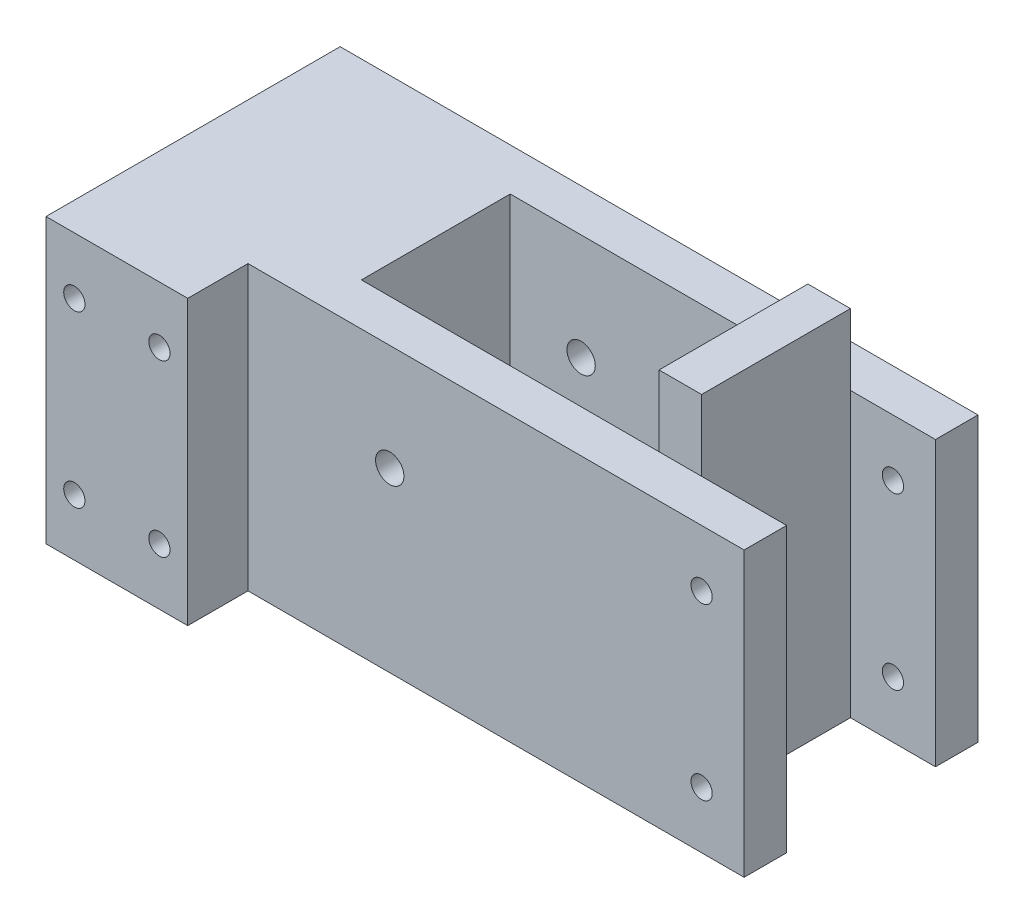
ISO-10303-21;
HEADER;
FILE_DESCRIPTION(('STEP AP214'),'2;1');
FILE_NAME('part.step','',(''),(''),'','','');
FILE_SCHEMA(('AUTOMOTIVE_DESIGN { 1 0 10303 214 1 1 1 1 }'));
ENDSEC;
DATA;
#1=APPLICATION_CONTEXT('core data for automotive mechanical design processes');
#2=APPLICATION_PROTOCOL_DEFINITION('international standard','automotive_design',2000,#1);
#3=PRODUCT_CONTEXT('',#1,'mechanical');
#4=PRODUCT('Part','Part','',(#3));
#5=PRODUCT_RELATED_PRODUCT_CATEGORY('part','',(#4));
#6=PRODUCT_DEFINITION_FORMATION('','',#4);
#7=PRODUCT_DEFINITION_CONTEXT('part definition',#1,'design');
#8=PRODUCT_DEFINITION('design','',#6,#7);
#9=PRODUCT_DEFINITION_SHAPE('','',#8);
#10=(LENGTH_UNIT() NAMED_UNIT(*) SI_UNIT(.MILLI.,.METRE.));
#11=(NAMED_UNIT(*) PLANE_ANGLE_UNIT() SI_UNIT($,.RADIAN.));
#12=(NAMED_UNIT(*) SI_UNIT($,.STERADIAN.) SOLID_ANGLE_UNIT());
#13=UNCERTAINTY_MEASURE_WITH_UNIT(LENGTH_MEASURE(1.E-05),#10,'distance_accuracy_value','');
#14=(GEOMETRIC_REPRESENTATION_CONTEXT(3) GLOBAL_UNCERTAINTY_ASSIGNED_CONTEXT((#13)) GLOBAL_UNIT_ASSIGNED_CONTEXT((#10,
#11,#12)) REPRESENTATION_CONTEXT('',''));
#15=CARTESIAN_POINT('',(0.,0.,0.));
#16=DIRECTION('',(0.,0.,1.));
#17=DIRECTION('',(1.,0.,0.));
#18=AXIS2_PLACEMENT_3D('',#15,#16,#17);
#19=CARTESIAN_POINT('',(30.,40.,-6.));
#20=DIRECTION('',(0.,0.,1.));
#21=DIRECTION('',(1.,0.,0.));
#22=AXIS2_PLACEMENT_3D('',#19,#20,#21);
#23=PLANE('',#22);
#24=CARTESIAN_POINT('',(84.,8.,-6.));
#25=DIRECTION('',(0.,0.,1.));
#26=DIRECTION('',(1.,0.,0.));
#27=AXIS2_PLACEMENT_3D('',#24,#25,#26);
#28=CIRCLE('',#27,1.5);
#29=CARTESIAN_POINT('',(85.5,8.,-6.));
#30=VERTEX_POINT('',#29);
#31=EDGE_CURVE('E242',#30,#30,#28,.T.);
#32=ORIENTED_EDGE('',*,*,#31,.T.);
#33=EDGE_LOOP('',(#32));
#34=FACE_BOUND('',#33,.T.);
#35=CARTESIAN_POINT('',(84.,32.,-6.));
#36=DIRECTION('',(0.,0.,1.));
#37=DIRECTION('',(1.,0.,0.));
#38=AXIS2_PLACEMENT_3D('',#35,#36,#37);
#39=CIRCLE('',#38,1.5);
#40=CARTESIAN_POINT('',(85.5,32.,-6.));
#41=VERTEX_POINT('',#40);
#42=EDGE_CURVE('E254',#41,#41,#39,.T.);
#43=ORIENTED_EDGE('',*,*,#42,.T.);
#44=EDGE_LOOP('',(#43));
#45=FACE_BOUND('',#44,.T.);
#46=DIRECTION('',(0.,-1.,0.));
#47=VECTOR('',#46,1.);
#48=CARTESIAN_POINT('',(78.,50.,-6.));
#49=LINE('',#48,#47);
#50=CARTESIAN_POINT('',(78.,40.,-6.));
#51=VERTEX_POINT('',#50);
#52=CARTESIAN_POINT('',(78.,0.,-6.));
#53=VERTEX_POINT('',#52);
#54=EDGE_CURVE('E199',#51,#53,#49,.T.);
#55=ORIENTED_EDGE('',*,*,#54,.F.);
#56=DIRECTION('',(-1.,0.,0.));
#57=VECTOR('',#56,1.);
#58=CARTESIAN_POINT('',(30.,40.,-6.));
#59=LINE('',#58,#57);
#60=CARTESIAN_POINT('',(90.,40.,-6.));
#61=VERTEX_POINT('',#60);
#62=EDGE_CURVE('E289',#61,#51,#59,.T.);
#63=ORIENTED_EDGE('',*,*,#62,.F.);
#64=DIRECTION('',(0.,-1.,0.));
#65=VECTOR('',#64,1.);
#66=CARTESIAN_POINT('',(90.,40.,-6.));
#67=LINE('',#66,#65);
#68=CARTESIAN_POINT('',(90.,0.,-6.));
#69=VERTEX_POINT('',#68);
#70=EDGE_CURVE('E51',#61,#69,#67,.T.);
#71=ORIENTED_EDGE('',*,*,#70,.T.);
#72=DIRECTION('',(-1.,0.,0.));
#73=VECTOR('',#72,1.);
#74=CARTESIAN_POINT('',(30.,0.,-6.));
#75=LINE('',#74,#73);
#76=EDGE_CURVE('E306',#69,#53,#75,.T.);
#77=ORIENTED_EDGE('',*,*,#76,.T.);
#78=EDGE_LOOP('',(#55,#63,#71,#77));
#79=FACE_BOUND('',#78,.T.);
#80=ADVANCED_FACE('F43',(#34,#45,#79),#23,.F.);
#81=CARTESIAN_POINT('',(90.,40.,-27.0000000000001));
#82=DIRECTION('',(0.,0.,-1.));
#83=DIRECTION('',(-1.,0.,0.));
#84=AXIS2_PLACEMENT_3D('',#81,#82,#83);
#85=PLANE('',#84);
#86=CARTESIAN_POINT('',(40.,25.,-27.0000000000001));
#87=DIRECTION('',(0.,0.,-1.));
#88=DIRECTION('',(-1.,0.,0.));
#89=AXIS2_PLACEMENT_3D('',#86,#87,#88);
#90=CIRCLE('',#89,2.);
#91=CARTESIAN_POINT('',(38.,25.,-27.0000000000001));
#92=VERTEX_POINT('',#91);
#93=EDGE_CURVE('E185',#92,#92,#90,.T.);
#94=ORIENTED_EDGE('',*,*,#93,.T.);
#95=EDGE_LOOP('',(#94));
#96=FACE_BOUND('',#95,.T.);
#97=DIRECTION('',(0.,-1.,0.));
#98=VECTOR('',#97,1.);
#99=CARTESIAN_POINT('',(72.,50.,-27.0000000000001));
#100=LINE('',#99,#98);
#101=CARTESIAN_POINT('',(72.,40.,-27.0000000000001));
#102=VERTEX_POINT('',#101);
#103=CARTESIAN_POINT('',(72.,0.,-27.0000000000001));
#104=VERTEX_POINT('',#103);
#105=EDGE_CURVE('E66',#102,#104,#100,.T.);
#106=ORIENTED_EDGE('',*,*,#105,.F.);
#107=DIRECTION('',(1.,0.,0.));
#108=VECTOR('',#107,1.);
#109=CARTESIAN_POINT('',(90.,40.,-27.0000000000001));
#110=LINE('',#109,#108);
#111=CARTESIAN_POINT('',(30.,40.,-27.0000000000001));
#112=VERTEX_POINT('',#111);
#113=EDGE_CURVE('E291',#112,#102,#110,.T.);
#114=ORIENTED_EDGE('',*,*,#113,.F.);
#115=DIRECTION('',(0.,-1.,0.));
#116=VECTOR('',#115,1.);
#117=CARTESIAN_POINT('',(30.,40.,-27.0000000000001));
#118=LINE('',#117,#116);
#119=CARTESIAN_POINT('',(30.,0.,-27.0000000000001));
#120=VERTEX_POINT('',#119);
#121=EDGE_CURVE('E160',#112,#120,#118,.T.);
#122=ORIENTED_EDGE('',*,*,#121,.T.);
#123=DIRECTION('',(1.,0.,0.));
#124=VECTOR('',#123,1.);
#125=CARTESIAN_POINT('',(90.,0.,-27.0000000000001));
#126=LINE('',#125,#124);
#127=EDGE_CURVE('E158',#120,#104,#126,.T.);
#128=ORIENTED_EDGE('',*,*,#127,.T.);
#129=EDGE_LOOP('',(#106,#114,#122,#128));
#130=FACE_BOUND('',#129,.T.);
#131=ADVANCED_FACE('F159',(#96,#130),#85,.F.);
#132=CARTESIAN_POINT('',(0.,40.,0.));
#133=DIRECTION('',(0.,0.,-1.));
#134=DIRECTION('',(-1.,0.,0.));
#135=AXIS2_PLACEMENT_3D('',#132,#133,#134);
#136=PLANE('',#135);
#137=CARTESIAN_POINT('',(40.,25.,0.));
#138=DIRECTION('',(0.,0.,1.));
#139=DIRECTION('',(1.,0.,0.));
#140=AXIS2_PLACEMENT_3D('',#137,#138,#139);
#141=CIRCLE('',#140,2.);
#142=CARTESIAN_POINT('',(42.,25.,0.));
#143=VERTEX_POINT('',#142);
#144=EDGE_CURVE('E471',#143,#143,#141,.T.);
#145=ORIENTED_EDGE('',*,*,#144,.F.);
#146=EDGE_LOOP('',(#145));
#147=FACE_BOUND('',#146,.T.);
#148=CARTESIAN_POINT('',(84.,32.,0.));
#149=DIRECTION('',(0.,0.,-1.));
#150=DIRECTION('',(-1.,0.,0.));
#151=AXIS2_PLACEMENT_3D('',#148,#149,#150);
#152=CIRCLE('',#151,1.5);
#153=CARTESIAN_POINT('',(82.5,32.,0.));
#154=VERTEX_POINT('',#153);
#155=EDGE_CURVE('E259',#154,#154,#152,.T.);
#156=ORIENTED_EDGE('',*,*,#155,.T.);
#157=EDGE_LOOP('',(#156));
#158=FACE_BOUND('',#157,.T.);
#159=CARTESIAN_POINT('',(84.,8.,0.));
#160=DIRECTION('',(0.,0.,-1.));
#161=DIRECTION('',(-1.,0.,0.));
#162=AXIS2_PLACEMENT_3D('',#159,#160,#161);
#163=CIRCLE('',#162,1.5);
#164=CARTESIAN_POINT('',(82.5,8.,0.));
#165=VERTEX_POINT('',#164);
#166=EDGE_CURVE('E250',#165,#165,#163,.T.);
#167=ORIENTED_EDGE('',*,*,#166,.T.);
#168=EDGE_LOOP('',(#167));
#169=FACE_BOUND('',#168,.T.);
#170=DIRECTION('',(0.,1.,0.));
#171=VECTOR('',#170,1.);
#172=CARTESIAN_POINT('',(20.,-21.7313138121007,0.));
#173=LINE('',#172,#171);
#174=CARTESIAN_POINT('',(20.,0.,0.));
#175=VERTEX_POINT('',#174);
#176=CARTESIAN_POINT('',(20.,40.,0.));
#177=VERTEX_POINT('',#176);
#178=EDGE_CURVE('E275',#175,#177,#173,.T.);
#179=ORIENTED_EDGE('',*,*,#178,.F.);
#180=DIRECTION('',(1.,0.,0.));
#181=VECTOR('',#180,1.);
#182=CARTESIAN_POINT('',(0.,0.,0.));
#183=LINE('',#182,#181);
#184=CARTESIAN_POINT('',(90.,0.,0.));
#185=VERTEX_POINT('',#184);
#186=EDGE_CURVE('E305',#175,#185,#183,.T.);
#187=ORIENTED_EDGE('',*,*,#186,.T.);
#188=DIRECTION('',(0.,-1.,0.));
#189=VECTOR('',#188,1.);
#190=CARTESIAN_POINT('',(90.,40.,0.));
#191=LINE('',#190,#189);
#192=CARTESIAN_POINT('',(90.,40.,0.));
#193=VERTEX_POINT('',#192);
#194=EDGE_CURVE('E11',#193,#185,#191,.T.);
#195=ORIENTED_EDGE('',*,*,#194,.F.);
#196=DIRECTION('',(1.,0.,0.));
#197=VECTOR('',#196,1.);
#198=CARTESIAN_POINT('',(0.,40.,0.));
#199=LINE('',#198,#197);
#200=EDGE_CURVE('E281',#177,#193,#199,.T.);
#201=ORIENTED_EDGE('',*,*,#200,.F.);
#202=EDGE_LOOP('',(#179,#187,#195,#201));
#203=FACE_BOUND('',#202,.T.);
#204=ADVANCED_FACE('F381',(#147,#158,#169,#203),#136,.F.);
#205=CARTESIAN_POINT('',(0.,40.,-33.0000000000001));
#206=DIRECTION('',(1.,0.,0.));
#207=DIRECTION('',(0.,0.,-1.));
#208=AXIS2_PLACEMENT_3D('',#205,#206,#207);
#209=PLANE('',#208);
#210=DIRECTION('',(0.,0.,1.));
#211=VECTOR('',#210,1.);
#212=CARTESIAN_POINT('',(0.,0.,-33.0000000000001));
#213=LINE('',#212,#211);
#214=CARTESIAN_POINT('',(0.,0.,-33.0000000000001));
#215=VERTEX_POINT('',#214);
#216=CARTESIAN_POINT('',(0.,0.,8.5));
#217=VERTEX_POINT('',#216);
#218=EDGE_CURVE('E268',#215,#217,#213,.T.);
#219=ORIENTED_EDGE('',*,*,#218,.T.);
#220=DIRECTION('',(0.,1.,0.));
#221=VECTOR('',#220,1.);
#222=CARTESIAN_POINT('',(0.,-21.7313138121007,8.5));
#223=LINE('',#222,#221);
#224=CARTESIAN_POINT('',(0.,40.,8.5));
#225=VERTEX_POINT('',#224);
#226=EDGE_CURVE('E274',#217,#225,#223,.T.);
#227=ORIENTED_EDGE('',*,*,#226,.T.);
#228=DIRECTION('',(0.,0.,1.));
#229=VECTOR('',#228,1.);
#230=CARTESIAN_POINT('',(0.,40.,-33.0000000000001));
#231=LINE('',#230,#229);
#232=CARTESIAN_POINT('',(0.,40.,-33.0000000000001));
#233=VERTEX_POINT('',#232);
#234=EDGE_CURVE('E278',#233,#225,#231,.T.);
#235=ORIENTED_EDGE('',*,*,#234,.F.);
#236=DIRECTION('',(0.,-1.,0.));
#237=VECTOR('',#236,1.);
#238=CARTESIAN_POINT('',(0.,40.,-33.0000000000001));
#239=LINE('',#238,#237);
#240=EDGE_CURVE('E297',#233,#215,#239,.T.);
#241=ORIENTED_EDGE('',*,*,#240,.T.);
#242=EDGE_LOOP('',(#219,#227,#235,#241));
#243=FACE_BOUND('',#242,.T.);
#244=ADVANCED_FACE('F44',(#243),#209,.F.);
#245=CARTESIAN_POINT('',(90.,40.,-6.));
#246=DIRECTION('',(-1.,0.,0.));
#247=DIRECTION('',(0.,0.,1.));
#248=AXIS2_PLACEMENT_3D('',#245,#246,#247);
#249=PLANE('',#248);
#250=DIRECTION('',(0.,0.,-1.));
#251=VECTOR('',#250,1.);
#252=CARTESIAN_POINT('',(90.,0.,-6.));
#253=LINE('',#252,#251);
#254=EDGE_CURVE('E302',#185,#69,#253,.T.);
#255=ORIENTED_EDGE('',*,*,#254,.T.);
#256=ORIENTED_EDGE('',*,*,#70,.F.);
#257=DIRECTION('',(0.,0.,-1.));
#258=VECTOR('',#257,1.);
#259=CARTESIAN_POINT('',(90.,40.,-6.));
#260=LINE('',#259,#258);
#261=EDGE_CURVE('E283',#193,#61,#260,.T.);
#262=ORIENTED_EDGE('',*,*,#261,.F.);
#263=ORIENTED_EDGE('',*,*,#194,.T.);
#264=EDGE_LOOP('',(#255,#256,#262,#263));
#265=FACE_BOUND('',#264,.T.);
#266=ADVANCED_FACE('F383',(#265),#249,.F.);
#267=CARTESIAN_POINT('',(40.,25.,-6.));
#268=DIRECTION('',(0.,0.,1.));
#269=DIRECTION('',(1.,0.,0.));
#270=AXIS2_PLACEMENT_3D('',#267,#268,#269);
#271=CIRCLE('',#270,2.);
#272=CARTESIAN_POINT('',(42.,25.,-6.));
#273=VERTEX_POINT('',#272);
#274=EDGE_CURVE('E189',#273,#273,#271,.T.);
#275=ORIENTED_EDGE('',*,*,#274,.T.);
#276=EDGE_LOOP('',(#275));
#277=FACE_BOUND('',#276,.T.);
#278=CARTESIAN_POINT('',(72.,40.,-6.));
#279=VERTEX_POINT('',#278);
#280=CARTESIAN_POINT('',(30.,40.,-6.));
#281=VERTEX_POINT('',#280);
#282=EDGE_CURVE('E288',#279,#281,#59,.T.);
#283=ORIENTED_EDGE('',*,*,#282,.F.);
#284=DIRECTION('',(0.,-1.,0.));
#285=VECTOR('',#284,1.);
#286=CARTESIAN_POINT('',(72.,50.,-6.));
#287=LINE('',#286,#285);
#288=CARTESIAN_POINT('',(72.,0.,-6.));
#289=VERTEX_POINT('',#288);
#290=EDGE_CURVE('E205',#279,#289,#287,.T.);
#291=ORIENTED_EDGE('',*,*,#290,.T.);
#292=CARTESIAN_POINT('',(30.,0.,-6.));
#293=VERTEX_POINT('',#292);
#294=EDGE_CURVE('E179',#289,#293,#75,.T.);
#295=ORIENTED_EDGE('',*,*,#294,.T.);
#296=DIRECTION('',(0.,-1.,0.));
#297=VECTOR('',#296,1.);
#298=CARTESIAN_POINT('',(30.,40.,-6.));
#299=LINE('',#298,#297);
#300=EDGE_CURVE('E324',#281,#293,#299,.T.);
#301=ORIENTED_EDGE('',*,*,#300,.F.);
#302=EDGE_LOOP('',(#283,#291,#295,#301));
#303=FACE_BOUND('',#302,.T.);
#304=ADVANCED_FACE('F355',(#277,#303),#23,.F.);
#305=CARTESIAN_POINT('',(30.,40.,-27.0000000000001));
#306=DIRECTION('',(-1.,0.,0.));
#307=DIRECTION('',(0.,0.,1.));
#308=AXIS2_PLACEMENT_3D('',#305,#306,#307);
#309=PLANE('',#308);
#310=DIRECTION('',(0.,0.,-1.));
#311=VECTOR('',#310,1.);
#312=CARTESIAN_POINT('',(30.,0.,-27.0000000000001));
#313=LINE('',#312,#311);
#314=EDGE_CURVE('E308',#293,#120,#313,.T.);
#315=ORIENTED_EDGE('',*,*,#314,.T.);
#316=ORIENTED_EDGE('',*,*,#121,.F.);
#317=DIRECTION('',(0.,0.,-1.));
#318=VECTOR('',#317,1.);
#319=CARTESIAN_POINT('',(30.,40.,-27.0000000000001));
#320=LINE('',#319,#318);
#321=EDGE_CURVE('E286',#281,#112,#320,.T.);
#322=ORIENTED_EDGE('',*,*,#321,.F.);
#323=ORIENTED_EDGE('',*,*,#300,.T.);
#324=EDGE_LOOP('',(#315,#316,#322,#323));
#325=FACE_BOUND('',#324,.T.);
#326=ADVANCED_FACE('F358',(#325),#309,.F.);
#327=CARTESIAN_POINT('',(84.,32.,-27.0000000000001));
#328=DIRECTION('',(0.,0.,-1.));
#329=DIRECTION('',(-1.,0.,0.));
#330=AXIS2_PLACEMENT_3D('',#327,#328,#329);
#331=CIRCLE('',#330,1.5);
#332=CARTESIAN_POINT('',(82.5,32.,-27.0000000000001));
#333=VERTEX_POINT('',#332);
#334=EDGE_CURVE('E249',#333,#333,#331,.T.);
#335=ORIENTED_EDGE('',*,*,#334,.T.);
#336=EDGE_LOOP('',(#335));
#337=FACE_BOUND('',#336,.T.);
#338=CARTESIAN_POINT('',(84.,8.,-27.0000000000001));
#339=DIRECTION('',(0.,0.,-1.));
#340=DIRECTION('',(-1.,0.,0.));
#341=AXIS2_PLACEMENT_3D('',#338,#339,#340);
#342=CIRCLE('',#341,1.5);
#343=CARTESIAN_POINT('',(82.5,8.,-27.0000000000001));
#344=VERTEX_POINT('',#343);
#345=EDGE_CURVE('E241',#344,#344,#342,.T.);
#346=ORIENTED_EDGE('',*,*,#345,.T.);
#347=EDGE_LOOP('',(#346));
#348=FACE_BOUND('',#347,.T.);
#349=CARTESIAN_POINT('',(78.,40.,-27.0000000000001));
#350=VERTEX_POINT('',#349);
#351=CARTESIAN_POINT('',(90.,40.,-27.0000000000001));
#352=VERTEX_POINT('',#351);
#353=EDGE_CURVE('E59',#350,#352,#110,.T.);
#354=ORIENTED_EDGE('',*,*,#353,.F.);
#355=DIRECTION('',(0.,-1.,0.));
#356=VECTOR('',#355,1.);
#357=CARTESIAN_POINT('',(78.,50.,-27.0000000000001));
#358=LINE('',#357,#356);
#359=CARTESIAN_POINT('',(78.,0.,-27.0000000000001));
#360=VERTEX_POINT('',#359);
#361=EDGE_CURVE('E210',#350,#360,#358,.T.);
#362=ORIENTED_EDGE('',*,*,#361,.T.);
#363=CARTESIAN_POINT('',(90.,0.,-27.0000000000001));
#364=VERTEX_POINT('',#363);
#365=EDGE_CURVE('E165',#360,#364,#126,.T.);
#366=ORIENTED_EDGE('',*,*,#365,.T.);
#367=DIRECTION('',(0.,-1.,0.));
#368=VECTOR('',#367,1.);
#369=CARTESIAN_POINT('',(90.,40.,-27.0000000000001));
#370=LINE('',#369,#368);
#371=EDGE_CURVE('E320',#352,#364,#370,.T.);
#372=ORIENTED_EDGE('',*,*,#371,.F.);
#373=EDGE_LOOP('',(#354,#362,#366,#372));
#374=FACE_BOUND('',#373,.T.);
#375=ADVANCED_FACE('F365',(#337,#348,#374),#85,.F.);
#376=CARTESIAN_POINT('',(90.,40.,-33.0000000000001));
#377=DIRECTION('',(-1.,0.,0.));
#378=DIRECTION('',(0.,0.,1.));
#379=AXIS2_PLACEMENT_3D('',#376,#377,#378);
#380=PLANE('',#379);
#381=DIRECTION('',(0.,0.,-1.));
#382=VECTOR('',#381,1.);
#383=CARTESIAN_POINT('',(90.,0.,-33.0000000000001));
#384=LINE('',#383,#382);
#385=CARTESIAN_POINT('',(90.,0.,-33.0000000000001));
#386=VERTEX_POINT('',#385);
#387=EDGE_CURVE('E161',#364,#386,#384,.T.);
#388=ORIENTED_EDGE('',*,*,#387,.T.);
#389=DIRECTION('',(0.,-1.,0.));
#390=VECTOR('',#389,1.);
#391=CARTESIAN_POINT('',(90.,40.,-33.0000000000001));
#392=LINE('',#391,#390);
#393=CARTESIAN_POINT('',(90.,40.,-33.0000000000001));
#394=VERTEX_POINT('',#393);
#395=EDGE_CURVE('E313',#394,#386,#392,.T.);
#396=ORIENTED_EDGE('',*,*,#395,.F.);
#397=DIRECTION('',(0.,0.,-1.));
#398=VECTOR('',#397,1.);
#399=CARTESIAN_POINT('',(90.,40.,-33.0000000000001));
#400=LINE('',#399,#398);
#401=EDGE_CURVE('E294',#352,#394,#400,.T.);
#402=ORIENTED_EDGE('',*,*,#401,.F.);
#403=ORIENTED_EDGE('',*,*,#371,.T.);
#404=EDGE_LOOP('',(#388,#396,#402,#403));
#405=FACE_BOUND('',#404,.T.);
#406=ADVANCED_FACE('F364',(#405),#380,.F.);
#407=CARTESIAN_POINT('',(0.,40.,-33.0000000000001));
#408=DIRECTION('',(0.,0.,1.));
#409=DIRECTION('',(1.,0.,0.));
#410=AXIS2_PLACEMENT_3D('',#407,#408,#409);
#411=PLANE('',#410);
#412=CARTESIAN_POINT('',(40.,25.,-33.0000000000001));
#413=DIRECTION('',(0.,0.,1.));
#414=DIRECTION('',(1.,0.,0.));
#415=AXIS2_PLACEMENT_3D('',#412,#413,#414);
#416=CIRCLE('',#415,2.);
#417=CARTESIAN_POINT('',(42.,25.,-33.0000000000001));
#418=VERTEX_POINT('',#417);
#419=EDGE_CURVE('E468',#418,#418,#416,.T.);
#420=ORIENTED_EDGE('',*,*,#419,.T.);
#421=EDGE_LOOP('',(#420));
#422=FACE_BOUND('',#421,.T.);
#423=CARTESIAN_POINT('',(3.99999999999996,32.,-33.0000000000001));
#424=DIRECTION('',(0.,0.,1.));
#425=DIRECTION('',(1.,0.,0.));
#426=AXIS2_PLACEMENT_3D('',#423,#424,#425);
#427=CIRCLE('',#426,1.5);
#428=CARTESIAN_POINT('',(5.49999999999996,32.,-33.0000000000001));
#429=VERTEX_POINT('',#428);
#430=EDGE_CURVE('E211',#429,#429,#427,.T.);
#431=ORIENTED_EDGE('',*,*,#430,.T.);
#432=EDGE_LOOP('',(#431));
#433=FACE_BOUND('',#432,.T.);
#434=CARTESIAN_POINT('',(3.99999999999996,8.,-33.0000000000001));
#435=DIRECTION('',(0.,0.,1.));
#436=DIRECTION('',(1.,0.,0.));
#437=AXIS2_PLACEMENT_3D('',#434,#435,#436);
#438=CIRCLE('',#437,1.5);
#439=CARTESIAN_POINT('',(5.49999999999996,8.,-33.0000000000001));
#440=VERTEX_POINT('',#439);
#441=EDGE_CURVE('E214',#440,#440,#438,.T.);
#442=ORIENTED_EDGE('',*,*,#441,.T.);
#443=EDGE_LOOP('',(#442));
#444=FACE_BOUND('',#443,.T.);
#445=CARTESIAN_POINT('',(16.,8.,-33.0000000000001));
#446=DIRECTION('',(0.,0.,-1.));
#447=DIRECTION('',(-1.,0.,0.));
#448=AXIS2_PLACEMENT_3D('',#445,#446,#447);
#449=CIRCLE('',#448,1.5);
#450=CARTESIAN_POINT('',(14.5,8.,-33.0000000000001));
#451=VERTEX_POINT('',#450);
#452=EDGE_CURVE('E234',#451,#451,#449,.T.);
#453=ORIENTED_EDGE('',*,*,#452,.F.);
#454=EDGE_LOOP('',(#453));
#455=FACE_BOUND('',#454,.T.);
#456=CARTESIAN_POINT('',(16.,32.,-33.0000000000001));
#457=DIRECTION('',(0.,0.,-1.));
#458=DIRECTION('',(-1.,0.,0.));
#459=AXIS2_PLACEMENT_3D('',#456,#457,#458);
#460=CIRCLE('',#459,1.5);
#461=CARTESIAN_POINT('',(14.5,32.,-33.0000000000001));
#462=VERTEX_POINT('',#461);
#463=EDGE_CURVE('E226',#462,#462,#460,.T.);
#464=ORIENTED_EDGE('',*,*,#463,.F.);
#465=EDGE_LOOP('',(#464));
#466=FACE_BOUND('',#465,.T.);
#467=CARTESIAN_POINT('',(84.,32.,-33.0000000000001));
#468=DIRECTION('',(0.,0.,-1.));
#469=DIRECTION('',(-1.,0.,0.));
#470=AXIS2_PLACEMENT_3D('',#467,#468,#469);
#471=CIRCLE('',#470,1.5);
#472=CARTESIAN_POINT('',(82.5,32.,-33.0000000000001));
#473=VERTEX_POINT('',#472);
#474=EDGE_CURVE('E225',#473,#473,#471,.T.);
#475=ORIENTED_EDGE('',*,*,#474,.F.);
#476=EDGE_LOOP('',(#475));
#477=FACE_BOUND('',#476,.T.);
#478=CARTESIAN_POINT('',(84.,8.,-33.0000000000001));
#479=DIRECTION('',(0.,0.,-1.));
#480=DIRECTION('',(-1.,0.,0.));
#481=AXIS2_PLACEMENT_3D('',#478,#479,#480);
#482=CIRCLE('',#481,1.5);
#483=CARTESIAN_POINT('',(82.5,8.,-33.0000000000001));
#484=VERTEX_POINT('',#483);
#485=EDGE_CURVE('E227',#484,#484,#482,.T.);
#486=ORIENTED_EDGE('',*,*,#485,.F.);
#487=EDGE_LOOP('',(#486));
#488=FACE_BOUND('',#487,.T.);
#489=DIRECTION('',(-1.,0.,0.));
#490=VECTOR('',#489,1.);
#491=CARTESIAN_POINT('',(0.,0.,-33.0000000000001));
#492=LINE('',#491,#490);
#493=EDGE_CURVE('E285',#386,#215,#492,.T.);
#494=ORIENTED_EDGE('',*,*,#493,.T.);
#495=ORIENTED_EDGE('',*,*,#240,.F.);
#496=DIRECTION('',(-1.,0.,0.));
#497=VECTOR('',#496,1.);
#498=CARTESIAN_POINT('',(0.,40.,-33.0000000000001));
#499=LINE('',#498,#497);
#500=EDGE_CURVE('E296',#394,#233,#499,.T.);
#501=ORIENTED_EDGE('',*,*,#500,.F.);
#502=ORIENTED_EDGE('',*,*,#395,.T.);
#503=EDGE_LOOP('',(#494,#495,#501,#502));
#504=FACE_BOUND('',#503,.T.);
#505=ADVANCED_FACE('F367',(#422,#433,#444,#455,#466,#477,#488,#504),#411,.F.);
#506=CARTESIAN_POINT('',(0.,40.,0.));
#507=DIRECTION('',(0.,1.,0.));
#508=DIRECTION('',(0.,0.,1.));
#509=AXIS2_PLACEMENT_3D('',#506,#507,#508);
#510=PLANE('',#509);
#511=ORIENTED_EDGE('',*,*,#234,.T.);
#512=DIRECTION('',(1.,0.,0.));
#513=VECTOR('',#512,1.);
#514=CARTESIAN_POINT('',(20.,40.,8.5));
#515=LINE('',#514,#513);
#516=CARTESIAN_POINT('',(20.,40.,8.5));
#517=VERTEX_POINT('',#516);
#518=EDGE_CURVE('E270',#225,#517,#515,.T.);
#519=ORIENTED_EDGE('',*,*,#518,.T.);
#520=DIRECTION('',(0.,0.,-1.));
#521=VECTOR('',#520,1.);
#522=CARTESIAN_POINT('',(20.,40.,8.5));
#523=LINE('',#522,#521);
#524=EDGE_CURVE('E258',#517,#177,#523,.T.);
#525=ORIENTED_EDGE('',*,*,#524,.T.);
#526=ORIENTED_EDGE('',*,*,#200,.T.);
#527=ORIENTED_EDGE('',*,*,#261,.T.);
#528=ORIENTED_EDGE('',*,*,#62,.T.);
#529=EDGE_CURVE('E293',#51,#279,#59,.T.);
#530=ORIENTED_EDGE('',*,*,#529,.T.);
#531=ORIENTED_EDGE('',*,*,#282,.T.);
#532=ORIENTED_EDGE('',*,*,#321,.T.);
#533=ORIENTED_EDGE('',*,*,#113,.T.);
#534=EDGE_CURVE('E298',#102,#350,#110,.T.);
#535=ORIENTED_EDGE('',*,*,#534,.T.);
#536=ORIENTED_EDGE('',*,*,#353,.T.);
#537=ORIENTED_EDGE('',*,*,#401,.T.);
#538=ORIENTED_EDGE('',*,*,#500,.T.);
#539=EDGE_LOOP('',(#511,#519,#525,#526,#527,#528,#530,#531,#532,#533,#535,#536,#537,#538));
#540=FACE_BOUND('',#539,.T.);
#541=ADVANCED_FACE('F346',(#540),#510,.T.);
#542=CARTESIAN_POINT('',(0.,0.,0.));
#543=DIRECTION('',(0.,1.,0.));
#544=DIRECTION('',(0.,0.,1.));
#545=AXIS2_PLACEMENT_3D('',#542,#543,#544);
#546=PLANE('',#545);
#547=ORIENTED_EDGE('',*,*,#294,.F.);
#548=DIRECTION('',(0.,0.,-1.));
#549=VECTOR('',#548,1.);
#550=CARTESIAN_POINT('',(72.,0.,-27.0000000000001));
#551=LINE('',#550,#549);
#552=EDGE_CURVE('E171',#289,#104,#551,.T.);
#553=ORIENTED_EDGE('',*,*,#552,.T.);
#554=ORIENTED_EDGE('',*,*,#127,.F.);
#555=ORIENTED_EDGE('',*,*,#314,.F.);
#556=EDGE_LOOP('',(#547,#553,#554,#555));
#557=FACE_BOUND('',#556,.T.);
#558=ORIENTED_EDGE('',*,*,#218,.F.);
#559=ORIENTED_EDGE('',*,*,#493,.F.);
#560=ORIENTED_EDGE('',*,*,#387,.F.);
#561=ORIENTED_EDGE('',*,*,#365,.F.);
#562=DIRECTION('',(0.,0.,1.));
#563=VECTOR('',#562,1.);
#564=CARTESIAN_POINT('',(78.,0.,-27.0000000000001));
#565=LINE('',#564,#563);
#566=EDGE_CURVE('E181',#360,#53,#565,.T.);
#567=ORIENTED_EDGE('',*,*,#566,.T.);
#568=ORIENTED_EDGE('',*,*,#76,.F.);
#569=ORIENTED_EDGE('',*,*,#254,.F.);
#570=ORIENTED_EDGE('',*,*,#186,.F.);
#571=DIRECTION('',(0.,0.,1.));
#572=VECTOR('',#571,1.);
#573=CARTESIAN_POINT('',(20.,0.,8.5));
#574=LINE('',#573,#572);
#575=CARTESIAN_POINT('',(20.,0.,8.5));
#576=VERTEX_POINT('',#575);
#577=EDGE_CURVE('E262',#175,#576,#574,.T.);
#578=ORIENTED_EDGE('',*,*,#577,.T.);
#579=DIRECTION('',(-1.,0.,0.));
#580=VECTOR('',#579,1.);
#581=CARTESIAN_POINT('',(20.,0.,8.5));
#582=LINE('',#581,#580);
#583=EDGE_CURVE('E257',#576,#217,#582,.T.);
#584=ORIENTED_EDGE('',*,*,#583,.T.);
#585=EDGE_LOOP('',(#558,#559,#560,#561,#567,#568,#569,#570,#578,#584));
#586=FACE_BOUND('',#585,.T.);
#587=ADVANCED_FACE('F178',(#557,#586),#546,.F.);
#588=CARTESIAN_POINT('',(20.,-21.7313138121007,8.5));
#589=DIRECTION('',(1.,0.,0.));
#590=DIRECTION('',(0.,0.,-1.));
#591=AXIS2_PLACEMENT_3D('',#588,#589,#590);
#592=PLANE('',#591);
#593=ORIENTED_EDGE('',*,*,#577,.F.);
#594=ORIENTED_EDGE('',*,*,#178,.T.);
#595=ORIENTED_EDGE('',*,*,#524,.F.);
#596=DIRECTION('',(0.,1.,0.));
#597=VECTOR('',#596,1.);
#598=CARTESIAN_POINT('',(20.,-21.7313138121007,8.5));
#599=LINE('',#598,#597);
#600=EDGE_CURVE('E263',#576,#517,#599,.T.);
#601=ORIENTED_EDGE('',*,*,#600,.F.);
#602=EDGE_LOOP('',(#593,#594,#595,#601));
#603=FACE_BOUND('',#602,.T.);
#604=ADVANCED_FACE('F382',(#603),#592,.T.);
#605=CARTESIAN_POINT('',(20.,-21.7313138121007,8.5));
#606=DIRECTION('',(0.,0.,1.));
#607=DIRECTION('',(1.,0.,0.));
#608=AXIS2_PLACEMENT_3D('',#605,#606,#607);
#609=PLANE('',#608);
#610=CARTESIAN_POINT('',(3.99999999999996,32.,8.5));
#611=DIRECTION('',(0.,0.,1.));
#612=DIRECTION('',(1.,0.,0.));
#613=AXIS2_PLACEMENT_3D('',#610,#611,#612);
#614=CIRCLE('',#613,1.5);
#615=CARTESIAN_POINT('',(5.49999999999996,32.,8.5));
#616=VERTEX_POINT('',#615);
#617=EDGE_CURVE('E216',#616,#616,#614,.T.);
#618=ORIENTED_EDGE('',*,*,#617,.F.);
#619=EDGE_LOOP('',(#618));
#620=FACE_BOUND('',#619,.T.);
#621=CARTESIAN_POINT('',(3.99999999999996,8.,8.5));
#622=DIRECTION('',(0.,0.,1.));
#623=DIRECTION('',(1.,0.,0.));
#624=AXIS2_PLACEMENT_3D('',#621,#622,#623);
#625=CIRCLE('',#624,1.5);
#626=CARTESIAN_POINT('',(5.49999999999996,8.,8.5));
#627=VERTEX_POINT('',#626);
#628=EDGE_CURVE('E218',#627,#627,#625,.T.);
#629=ORIENTED_EDGE('',*,*,#628,.F.);
#630=EDGE_LOOP('',(#629));
#631=FACE_BOUND('',#630,.T.);
#632=CARTESIAN_POINT('',(16.,8.,8.5));
#633=DIRECTION('',(0.,0.,-1.));
#634=DIRECTION('',(-1.,0.,0.));
#635=AXIS2_PLACEMENT_3D('',#632,#633,#634);
#636=CIRCLE('',#635,1.5);
#637=CARTESIAN_POINT('',(14.5,8.,8.5));
#638=VERTEX_POINT('',#637);
#639=EDGE_CURVE('E212',#638,#638,#636,.T.);
#640=ORIENTED_EDGE('',*,*,#639,.T.);
#641=EDGE_LOOP('',(#640));
#642=FACE_BOUND('',#641,.T.);
#643=CARTESIAN_POINT('',(16.,32.,8.5));
#644=DIRECTION('',(0.,0.,-1.));
#645=DIRECTION('',(-1.,0.,0.));
#646=AXIS2_PLACEMENT_3D('',#643,#644,#645);
#647=CIRCLE('',#646,1.5);
#648=CARTESIAN_POINT('',(14.5,32.,8.5));
#649=VERTEX_POINT('',#648);
#650=EDGE_CURVE('E233',#649,#649,#647,.T.);
#651=ORIENTED_EDGE('',*,*,#650,.T.);
#652=EDGE_LOOP('',(#651));
#653=FACE_BOUND('',#652,.T.);
#654=ORIENTED_EDGE('',*,*,#583,.F.);
#655=ORIENTED_EDGE('',*,*,#600,.T.);
#656=ORIENTED_EDGE('',*,*,#518,.F.);
#657=ORIENTED_EDGE('',*,*,#226,.F.);
#658=EDGE_LOOP('',(#654,#655,#656,#657));
#659=FACE_BOUND('',#658,.T.);
#660=ADVANCED_FACE('F376',(#620,#631,#642,#653,#659),#609,.T.);
#661=CARTESIAN_POINT('',(16.,32.,8.5));
#662=DIRECTION('',(0.,0.,-1.));
#663=DIRECTION('',(-1.,0.,0.));
#664=AXIS2_PLACEMENT_3D('',#661,#662,#663);
#665=CYLINDRICAL_SURFACE('',#664,1.5);
#666=ORIENTED_EDGE('',*,*,#650,.F.);
#667=EDGE_LOOP('',(#666));
#668=FACE_BOUND('',#667,.T.);
#669=ORIENTED_EDGE('',*,*,#463,.T.);
#670=EDGE_LOOP('',(#669));
#671=FACE_BOUND('',#670,.T.);
#672=ADVANCED_FACE('F423',(#668,#671),#665,.F.);
#673=CARTESIAN_POINT('',(16.,8.,8.5));
#674=DIRECTION('',(0.,0.,-1.));
#675=DIRECTION('',(-1.,0.,0.));
#676=AXIS2_PLACEMENT_3D('',#673,#674,#675);
#677=CYLINDRICAL_SURFACE('',#676,1.5);
#678=ORIENTED_EDGE('',*,*,#639,.F.);
#679=EDGE_LOOP('',(#678));
#680=FACE_BOUND('',#679,.T.);
#681=ORIENTED_EDGE('',*,*,#452,.T.);
#682=EDGE_LOOP('',(#681));
#683=FACE_BOUND('',#682,.T.);
#684=ADVANCED_FACE('F427',(#680,#683),#677,.F.);
#685=CARTESIAN_POINT('',(84.,8.,8.5));
#686=DIRECTION('',(0.,0.,-1.));
#687=DIRECTION('',(-1.,0.,0.));
#688=AXIS2_PLACEMENT_3D('',#685,#686,#687);
#689=CYLINDRICAL_SURFACE('',#688,1.5);
#690=ORIENTED_EDGE('',*,*,#485,.T.);
#691=EDGE_LOOP('',(#690));
#692=FACE_BOUND('',#691,.T.);
#693=ORIENTED_EDGE('',*,*,#345,.F.);
#694=EDGE_LOOP('',(#693));
#695=FACE_BOUND('',#694,.T.);
#696=ADVANCED_FACE('F429',(#692,#695),#689,.F.);
#697=CARTESIAN_POINT('',(84.,32.,8.5));
#698=DIRECTION('',(0.,0.,-1.));
#699=DIRECTION('',(-1.,0.,0.));
#700=AXIS2_PLACEMENT_3D('',#697,#698,#699);
#701=CYLINDRICAL_SURFACE('',#700,1.5);
#702=ORIENTED_EDGE('',*,*,#474,.T.);
#703=EDGE_LOOP('',(#702));
#704=FACE_BOUND('',#703,.T.);
#705=ORIENTED_EDGE('',*,*,#334,.F.);
#706=EDGE_LOOP('',(#705));
#707=FACE_BOUND('',#706,.T.);
#708=ADVANCED_FACE('F430',(#704,#707),#701,.F.);
#709=ORIENTED_EDGE('',*,*,#31,.F.);
#710=EDGE_LOOP('',(#709));
#711=FACE_BOUND('',#710,.T.);
#712=ORIENTED_EDGE('',*,*,#166,.F.);
#713=EDGE_LOOP('',(#712));
#714=FACE_BOUND('',#713,.T.);
#715=ADVANCED_FACE('F421',(#711,#714),#689,.F.);
#716=ORIENTED_EDGE('',*,*,#42,.F.);
#717=EDGE_LOOP('',(#716));
#718=FACE_BOUND('',#717,.T.);
#719=ORIENTED_EDGE('',*,*,#155,.F.);
#720=EDGE_LOOP('',(#719));
#721=FACE_BOUND('',#720,.T.);
#722=ADVANCED_FACE('F428',(#718,#721),#701,.F.);
#723=CARTESIAN_POINT('',(3.99999999999996,8.,-33.0000000000001));
#724=DIRECTION('',(0.,0.,1.));
#725=DIRECTION('',(1.,0.,0.));
#726=AXIS2_PLACEMENT_3D('',#723,#724,#725);
#727=CYLINDRICAL_SURFACE('',#726,1.5);
#728=ORIENTED_EDGE('',*,*,#441,.F.);
#729=EDGE_LOOP('',(#728));
#730=FACE_BOUND('',#729,.T.);
#731=ORIENTED_EDGE('',*,*,#628,.T.);
#732=EDGE_LOOP('',(#731));
#733=FACE_BOUND('',#732,.T.);
#734=ADVANCED_FACE('F437',(#730,#733),#727,.F.);
#735=CARTESIAN_POINT('',(3.99999999999996,32.,-33.0000000000001));
#736=DIRECTION('',(0.,0.,1.));
#737=DIRECTION('',(1.,0.,0.));
#738=AXIS2_PLACEMENT_3D('',#735,#736,#737);
#739=CYLINDRICAL_SURFACE('',#738,1.5);
#740=ORIENTED_EDGE('',*,*,#430,.F.);
#741=EDGE_LOOP('',(#740));
#742=FACE_BOUND('',#741,.T.);
#743=ORIENTED_EDGE('',*,*,#617,.T.);
#744=EDGE_LOOP('',(#743));
#745=FACE_BOUND('',#744,.T.);
#746=ADVANCED_FACE('F442',(#742,#745),#739,.F.);
#747=CARTESIAN_POINT('',(78.,50.,-27.0000000000001));
#748=DIRECTION('',(-1.,0.,0.));
#749=DIRECTION('',(0.,0.,1.));
#750=AXIS2_PLACEMENT_3D('',#747,#748,#749);
#751=PLANE('',#750);
#752=CARTESIAN_POINT('',(78.,50.,-6.));
#753=VERTEX_POINT('',#752);
#754=EDGE_CURVE('E203',#753,#51,#49,.T.);
#755=ORIENTED_EDGE('',*,*,#754,.T.);
#756=ORIENTED_EDGE('',*,*,#54,.T.);
#757=ORIENTED_EDGE('',*,*,#566,.F.);
#758=ORIENTED_EDGE('',*,*,#361,.F.);
#759=CARTESIAN_POINT('',(78.,50.,-27.0000000000001));
#760=VERTEX_POINT('',#759);
#761=EDGE_CURVE('E206',#760,#350,#358,.T.);
#762=ORIENTED_EDGE('',*,*,#761,.F.);
#763=DIRECTION('',(0.,0.,-1.));
#764=VECTOR('',#763,1.);
#765=CARTESIAN_POINT('',(78.,50.,-27.0000000000001));
#766=LINE('',#765,#764);
#767=EDGE_CURVE('E184',#753,#760,#766,.T.);
#768=ORIENTED_EDGE('',*,*,#767,.F.);
#769=EDGE_LOOP('',(#755,#756,#757,#758,#762,#768));
#770=FACE_BOUND('',#769,.T.);
#771=ADVANCED_FACE('F339',(#770),#751,.F.);
#772=CARTESIAN_POINT('',(78.,50.,-27.0000000000001));
#773=DIRECTION('',(0.,0.,1.));
#774=DIRECTION('',(1.,0.,0.));
#775=AXIS2_PLACEMENT_3D('',#772,#773,#774);
#776=PLANE('',#775);
#777=ORIENTED_EDGE('',*,*,#534,.F.);
#778=CARTESIAN_POINT('',(72.,50.,-27.0000000000001));
#779=VERTEX_POINT('',#778);
#780=EDGE_CURVE('E172',#779,#102,#100,.T.);
#781=ORIENTED_EDGE('',*,*,#780,.F.);
#782=DIRECTION('',(-1.,0.,0.));
#783=VECTOR('',#782,1.);
#784=CARTESIAN_POINT('',(78.,50.,-27.0000000000001));
#785=LINE('',#784,#783);
#786=EDGE_CURVE('E193',#760,#779,#785,.T.);
#787=ORIENTED_EDGE('',*,*,#786,.F.);
#788=ORIENTED_EDGE('',*,*,#761,.T.);
#789=EDGE_LOOP('',(#777,#781,#787,#788));
#790=FACE_BOUND('',#789,.T.);
#791=ADVANCED_FACE('F360',(#790),#776,.F.);
#792=CARTESIAN_POINT('',(72.,50.,-27.0000000000001));
#793=DIRECTION('',(1.,0.,0.));
#794=DIRECTION('',(0.,0.,-1.));
#795=AXIS2_PLACEMENT_3D('',#792,#793,#794);
#796=PLANE('',#795);
#797=ORIENTED_EDGE('',*,*,#780,.T.);
#798=ORIENTED_EDGE('',*,*,#105,.T.);
#799=ORIENTED_EDGE('',*,*,#552,.F.);
#800=ORIENTED_EDGE('',*,*,#290,.F.);
#801=CARTESIAN_POINT('',(72.,50.,-6.));
#802=VERTEX_POINT('',#801);
#803=EDGE_CURVE('E174',#802,#279,#287,.T.);
#804=ORIENTED_EDGE('',*,*,#803,.F.);
#805=DIRECTION('',(0.,0.,1.));
#806=VECTOR('',#805,1.);
#807=CARTESIAN_POINT('',(72.,50.,-27.0000000000001));
#808=LINE('',#807,#806);
#809=EDGE_CURVE('E196',#779,#802,#808,.T.);
#810=ORIENTED_EDGE('',*,*,#809,.F.);
#811=EDGE_LOOP('',(#797,#798,#799,#800,#804,#810));
#812=FACE_BOUND('',#811,.T.);
#813=ADVANCED_FACE('F169',(#812),#796,.F.);
#814=CARTESIAN_POINT('',(78.,50.,-6.));
#815=DIRECTION('',(0.,0.,-1.));
#816=DIRECTION('',(-1.,0.,0.));
#817=AXIS2_PLACEMENT_3D('',#814,#815,#816);
#818=PLANE('',#817);
#819=ORIENTED_EDGE('',*,*,#529,.F.);
#820=ORIENTED_EDGE('',*,*,#754,.F.);
#821=DIRECTION('',(1.,0.,0.));
#822=VECTOR('',#821,1.);
#823=CARTESIAN_POINT('',(78.,50.,-6.));
#824=LINE('',#823,#822);
#825=EDGE_CURVE('E197',#802,#753,#824,.T.);
#826=ORIENTED_EDGE('',*,*,#825,.F.);
#827=ORIENTED_EDGE('',*,*,#803,.T.);
#828=EDGE_LOOP('',(#819,#820,#826,#827));
#829=FACE_BOUND('',#828,.T.);
#830=ADVANCED_FACE('F347',(#829),#818,.F.);
#831=CARTESIAN_POINT('',(0.,50.,0.));
#832=DIRECTION('',(0.,-1.,0.));
#833=DIRECTION('',(0.,0.,-1.));
#834=AXIS2_PLACEMENT_3D('',#831,#832,#833);
#835=PLANE('',#834);
#836=ORIENTED_EDGE('',*,*,#767,.T.);
#837=ORIENTED_EDGE('',*,*,#786,.T.);
#838=ORIENTED_EDGE('',*,*,#809,.T.);
#839=ORIENTED_EDGE('',*,*,#825,.T.);
#840=EDGE_LOOP('',(#836,#837,#838,#839));
#841=FACE_BOUND('',#840,.T.);
#842=ADVANCED_FACE('F452',(#841),#835,.F.);
#843=CARTESIAN_POINT('',(40.,25.,-33.0000000000001));
#844=DIRECTION('',(0.,0.,1.));
#845=DIRECTION('',(1.,0.,0.));
#846=AXIS2_PLACEMENT_3D('',#843,#844,#845);
#847=CYLINDRICAL_SURFACE('',#846,2.);
#848=ORIENTED_EDGE('',*,*,#419,.F.);
#849=EDGE_LOOP('',(#848));
#850=FACE_BOUND('',#849,.T.);
#851=ORIENTED_EDGE('',*,*,#93,.F.);
#852=EDGE_LOOP('',(#851));
#853=FACE_BOUND('',#852,.T.);
#854=ADVANCED_FACE('F457',(#850,#853),#847,.F.);
#855=ORIENTED_EDGE('',*,*,#144,.T.);
#856=EDGE_LOOP('',(#855));
#857=FACE_BOUND('',#856,.T.);
#858=ORIENTED_EDGE('',*,*,#274,.F.);
#859=EDGE_LOOP('',(#858));
#860=FACE_BOUND('',#859,.T.);
#861=ADVANCED_FACE('F463',(#857,#860),#847,.F.);
#862=CLOSED_SHELL('',(#80,#131,#204,#244,#266,#304,#326,#375,#406,#505,#541,#587,#604,#660,#672,
#684,#696,#708,#715,#722,#734,#746,#771,#791,#813,#830,#842,#854,#861));
#863=MANIFOLD_SOLID_BREP('B2',#862);
#864=ADVANCED_BREP_SHAPE_REPRESENTATION('',(#18,#863),#14);
#865=SHAPE_DEFINITION_REPRESENTATION(#9,#864);
ENDSEC;
END-ISO-10303-21;
